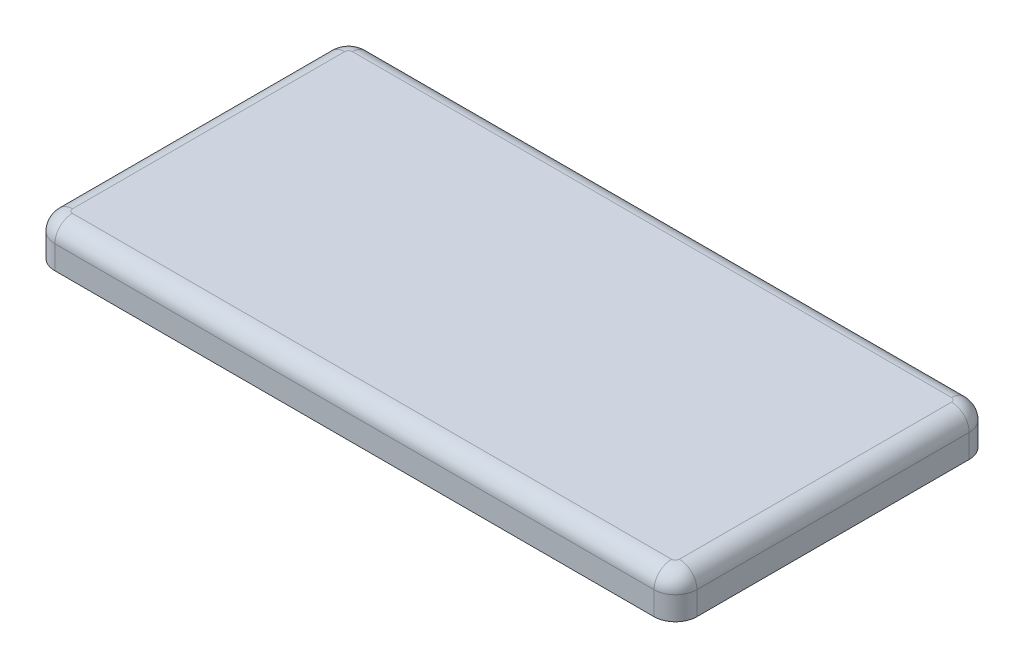
ISO-10303-21;
HEADER;
FILE_DESCRIPTION(('STEP AP214'),'2;1');
FILE_NAME('part.step','',(''),(''),'','','');
FILE_SCHEMA(('AUTOMOTIVE_DESIGN { 1 0 10303 214 1 1 1 1 }'));
ENDSEC;
DATA;
#1=APPLICATION_CONTEXT('core data for automotive mechanical design processes');
#2=APPLICATION_PROTOCOL_DEFINITION('international standard','automotive_design',2000,#1);
#3=PRODUCT_CONTEXT('',#1,'mechanical');
#4=PRODUCT('Part','Part','',(#3));
#5=PRODUCT_RELATED_PRODUCT_CATEGORY('part','',(#4));
#6=PRODUCT_DEFINITION_FORMATION('','',#4);
#7=PRODUCT_DEFINITION_CONTEXT('part definition',#1,'design');
#8=PRODUCT_DEFINITION('design','',#6,#7);
#9=PRODUCT_DEFINITION_SHAPE('','',#8);
#10=(LENGTH_UNIT() NAMED_UNIT(*) SI_UNIT(.MILLI.,.METRE.));
#11=(NAMED_UNIT(*) PLANE_ANGLE_UNIT() SI_UNIT($,.RADIAN.));
#12=(NAMED_UNIT(*) SI_UNIT($,.STERADIAN.) SOLID_ANGLE_UNIT());
#13=UNCERTAINTY_MEASURE_WITH_UNIT(LENGTH_MEASURE(1.E-05),#10,'distance_accuracy_value','');
#14=(GEOMETRIC_REPRESENTATION_CONTEXT(3) GLOBAL_UNCERTAINTY_ASSIGNED_CONTEXT((#13)) GLOBAL_UNIT_ASSIGNED_CONTEXT((#10,
#11,#12)) REPRESENTATION_CONTEXT('',''));
#15=CARTESIAN_POINT('',(0.,0.,0.));
#16=DIRECTION('',(0.,0.,1.));
#17=DIRECTION('',(1.,0.,0.));
#18=AXIS2_PLACEMENT_3D('',#15,#16,#17);
#19=CARTESIAN_POINT('',(-30.7,4.2,13.95));
#20=DIRECTION('',(0.,-1.,0.));
#21=DIRECTION('',(0.,0.,-1.));
#22=AXIS2_PLACEMENT_3D('',#19,#20,#21);
#23=CYLINDRICAL_SURFACE('',#22,2.2);
#24=DIRECTION('',(0.,-1.,0.));
#25=VECTOR('',#24,1.);
#26=CARTESIAN_POINT('',(-30.7,4.2,16.15));
#27=LINE('',#26,#25);
#28=CARTESIAN_POINT('',(-30.7,2.4,16.15));
#29=VERTEX_POINT('',#28);
#30=CARTESIAN_POINT('',(-30.7,0.,16.15));
#31=VERTEX_POINT('',#30);
#32=EDGE_CURVE('E309',#29,#31,#27,.T.);
#33=ORIENTED_EDGE('',*,*,#32,.F.);
#34=CARTESIAN_POINT('',(-30.7,2.4,13.95));
#35=DIRECTION('',(0.,1.,0.));
#36=DIRECTION('',(0.,0.,1.));
#37=AXIS2_PLACEMENT_3D('',#34,#35,#36);
#38=CIRCLE('',#37,2.2);
#39=CARTESIAN_POINT('',(-32.9,2.4,13.95));
#40=VERTEX_POINT('',#39);
#41=EDGE_CURVE('E44',#29,#40,#38,.F.);
#42=ORIENTED_EDGE('',*,*,#41,.T.);
#43=DIRECTION('',(0.,-1.,0.));
#44=VECTOR('',#43,1.);
#45=CARTESIAN_POINT('',(-32.9,4.2,13.95));
#46=LINE('',#45,#44);
#47=CARTESIAN_POINT('',(-32.9,0.,13.95));
#48=VERTEX_POINT('',#47);
#49=EDGE_CURVE('E295',#40,#48,#46,.T.);
#50=ORIENTED_EDGE('',*,*,#49,.T.);
#51=CARTESIAN_POINT('',(-30.7,0.,13.95));
#52=DIRECTION('',(0.,1.,0.));
#53=DIRECTION('',(0.,0.,1.));
#54=AXIS2_PLACEMENT_3D('',#51,#52,#53);
#55=CIRCLE('',#54,2.2);
#56=EDGE_CURVE('E271',#48,#31,#55,.T.);
#57=ORIENTED_EDGE('',*,*,#56,.T.);
#58=EDGE_LOOP('',(#33,#42,#50,#57));
#59=FACE_BOUND('',#58,.T.);
#60=ADVANCED_FACE('F35',(#59),#23,.T.);
#61=CARTESIAN_POINT('',(-30.7,4.2,16.15));
#62=DIRECTION('',(0.,0.,-1.));
#63=DIRECTION('',(-1.,0.,0.));
#64=AXIS2_PLACEMENT_3D('',#61,#62,#63);
#65=PLANE('',#64);
#66=DIRECTION('',(0.,-1.,0.));
#67=VECTOR('',#66,1.);
#68=CARTESIAN_POINT('',(30.7,4.2,16.15));
#69=LINE('',#68,#67);
#70=CARTESIAN_POINT('',(30.7,2.4,16.15));
#71=VERTEX_POINT('',#70);
#72=CARTESIAN_POINT('',(30.7,0.,16.15));
#73=VERTEX_POINT('',#72);
#74=EDGE_CURVE('E307',#71,#73,#69,.T.);
#75=ORIENTED_EDGE('',*,*,#74,.F.);
#76=DIRECTION('',(1.,0.,0.));
#77=VECTOR('',#76,1.);
#78=CARTESIAN_POINT('',(-30.7,2.4,16.15));
#79=LINE('',#78,#77);
#80=EDGE_CURVE('E11',#71,#29,#79,.F.);
#81=ORIENTED_EDGE('',*,*,#80,.T.);
#82=ORIENTED_EDGE('',*,*,#32,.T.);
#83=DIRECTION('',(1.,0.,0.));
#84=VECTOR('',#83,1.);
#85=CARTESIAN_POINT('',(-30.7,0.,16.15));
#86=LINE('',#85,#84);
#87=EDGE_CURVE('E274',#31,#73,#86,.T.);
#88=ORIENTED_EDGE('',*,*,#87,.T.);
#89=EDGE_LOOP('',(#75,#81,#82,#88));
#90=FACE_BOUND('',#89,.T.);
#91=ADVANCED_FACE('F423',(#90),#65,.F.);
#92=CARTESIAN_POINT('',(30.7,4.2,13.95));
#93=DIRECTION('',(0.,-1.,0.));
#94=DIRECTION('',(0.,0.,-1.));
#95=AXIS2_PLACEMENT_3D('',#92,#93,#94);
#96=CYLINDRICAL_SURFACE('',#95,2.2);
#97=DIRECTION('',(0.,-1.,0.));
#98=VECTOR('',#97,1.);
#99=CARTESIAN_POINT('',(32.9,4.2,13.95));
#100=LINE('',#99,#98);
#101=CARTESIAN_POINT('',(32.9,2.4,13.95));
#102=VERTEX_POINT('',#101);
#103=CARTESIAN_POINT('',(32.9,0.,13.95));
#104=VERTEX_POINT('',#103);
#105=EDGE_CURVE('E305',#102,#104,#100,.T.);
#106=ORIENTED_EDGE('',*,*,#105,.F.);
#107=CARTESIAN_POINT('',(30.7,2.4,13.95));
#108=DIRECTION('',(0.,1.,0.));
#109=DIRECTION('',(0.,0.,1.));
#110=AXIS2_PLACEMENT_3D('',#107,#108,#109);
#111=CIRCLE('',#110,2.2);
#112=EDGE_CURVE('E328',#102,#71,#111,.F.);
#113=ORIENTED_EDGE('',*,*,#112,.T.);
#114=ORIENTED_EDGE('',*,*,#74,.T.);
#115=CARTESIAN_POINT('',(30.7,0.,13.95));
#116=DIRECTION('',(0.,1.,0.));
#117=DIRECTION('',(0.,0.,1.));
#118=AXIS2_PLACEMENT_3D('',#115,#116,#117);
#119=CIRCLE('',#118,2.2);
#120=EDGE_CURVE('E277',#73,#104,#119,.T.);
#121=ORIENTED_EDGE('',*,*,#120,.T.);
#122=EDGE_LOOP('',(#106,#113,#114,#121));
#123=FACE_BOUND('',#122,.T.);
#124=ADVANCED_FACE('F421',(#123),#96,.T.);
#125=CARTESIAN_POINT('',(32.9,4.2,-13.95));
#126=DIRECTION('',(-1.,0.,0.));
#127=DIRECTION('',(0.,0.,1.));
#128=AXIS2_PLACEMENT_3D('',#125,#126,#127);
#129=PLANE('',#128);
#130=DIRECTION('',(0.,-1.,0.));
#131=VECTOR('',#130,1.);
#132=CARTESIAN_POINT('',(32.9,4.2,-13.95));
#133=LINE('',#132,#131);
#134=CARTESIAN_POINT('',(32.9,2.4,-13.95));
#135=VERTEX_POINT('',#134);
#136=CARTESIAN_POINT('',(32.9,0.,-13.95));
#137=VERTEX_POINT('',#136);
#138=EDGE_CURVE('E303',#135,#137,#133,.T.);
#139=ORIENTED_EDGE('',*,*,#138,.F.);
#140=DIRECTION('',(0.,0.,-1.));
#141=VECTOR('',#140,1.);
#142=CARTESIAN_POINT('',(32.9,2.4,13.95));
#143=LINE('',#142,#141);
#144=EDGE_CURVE('E331',#135,#102,#143,.F.);
#145=ORIENTED_EDGE('',*,*,#144,.T.);
#146=ORIENTED_EDGE('',*,*,#105,.T.);
#147=DIRECTION('',(0.,0.,-1.));
#148=VECTOR('',#147,1.);
#149=CARTESIAN_POINT('',(32.9,0.,-13.95));
#150=LINE('',#149,#148);
#151=EDGE_CURVE('E280',#104,#137,#150,.T.);
#152=ORIENTED_EDGE('',*,*,#151,.T.);
#153=EDGE_LOOP('',(#139,#145,#146,#152));
#154=FACE_BOUND('',#153,.T.);
#155=ADVANCED_FACE('F416',(#154),#129,.F.);
#156=CARTESIAN_POINT('',(30.7,4.2,-13.95));
#157=DIRECTION('',(0.,-1.,0.));
#158=DIRECTION('',(0.,0.,-1.));
#159=AXIS2_PLACEMENT_3D('',#156,#157,#158);
#160=CYLINDRICAL_SURFACE('',#159,2.2);
#161=DIRECTION('',(0.,-1.,0.));
#162=VECTOR('',#161,1.);
#163=CARTESIAN_POINT('',(30.7,4.2,-16.15));
#164=LINE('',#163,#162);
#165=CARTESIAN_POINT('',(30.7,2.4,-16.15));
#166=VERTEX_POINT('',#165);
#167=CARTESIAN_POINT('',(30.7,0.,-16.15));
#168=VERTEX_POINT('',#167);
#169=EDGE_CURVE('E301',#166,#168,#164,.T.);
#170=ORIENTED_EDGE('',*,*,#169,.F.);
#171=CARTESIAN_POINT('',(30.7,2.4,-13.95));
#172=DIRECTION('',(0.,1.,0.));
#173=DIRECTION('',(0.,0.,1.));
#174=AXIS2_PLACEMENT_3D('',#171,#172,#173);
#175=CIRCLE('',#174,2.2);
#176=EDGE_CURVE('E333',#166,#135,#175,.F.);
#177=ORIENTED_EDGE('',*,*,#176,.T.);
#178=ORIENTED_EDGE('',*,*,#138,.T.);
#179=CARTESIAN_POINT('',(30.7,0.,-13.95));
#180=DIRECTION('',(0.,1.,0.));
#181=DIRECTION('',(0.,0.,-1.));
#182=AXIS2_PLACEMENT_3D('',#179,#180,#181);
#183=CIRCLE('',#182,2.2);
#184=EDGE_CURVE('E283',#137,#168,#183,.T.);
#185=ORIENTED_EDGE('',*,*,#184,.T.);
#186=EDGE_LOOP('',(#170,#177,#178,#185));
#187=FACE_BOUND('',#186,.T.);
#188=ADVANCED_FACE('F414',(#187),#160,.T.);
#189=CARTESIAN_POINT('',(-30.7,4.2,-16.15));
#190=DIRECTION('',(0.,0.,1.));
#191=DIRECTION('',(1.,0.,0.));
#192=AXIS2_PLACEMENT_3D('',#189,#190,#191);
#193=PLANE('',#192);
#194=DIRECTION('',(0.,-1.,0.));
#195=VECTOR('',#194,1.);
#196=CARTESIAN_POINT('',(-30.7,4.2,-16.15));
#197=LINE('',#196,#195);
#198=CARTESIAN_POINT('',(-30.7,2.4,-16.15));
#199=VERTEX_POINT('',#198);
#200=CARTESIAN_POINT('',(-30.7,0.,-16.15));
#201=VERTEX_POINT('',#200);
#202=EDGE_CURVE('E299',#199,#201,#197,.T.);
#203=ORIENTED_EDGE('',*,*,#202,.F.);
#204=DIRECTION('',(-1.,0.,0.));
#205=VECTOR('',#204,1.);
#206=CARTESIAN_POINT('',(30.7,2.4,-16.15));
#207=LINE('',#206,#205);
#208=EDGE_CURVE('E335',#199,#166,#207,.F.);
#209=ORIENTED_EDGE('',*,*,#208,.T.);
#210=ORIENTED_EDGE('',*,*,#169,.T.);
#211=DIRECTION('',(-1.,0.,0.));
#212=VECTOR('',#211,1.);
#213=CARTESIAN_POINT('',(-30.7,0.,-16.15));
#214=LINE('',#213,#212);
#215=EDGE_CURVE('E286',#168,#201,#214,.T.);
#216=ORIENTED_EDGE('',*,*,#215,.T.);
#217=EDGE_LOOP('',(#203,#209,#210,#216));
#218=FACE_BOUND('',#217,.T.);
#219=ADVANCED_FACE('F378',(#218),#193,.F.);
#220=CARTESIAN_POINT('',(-30.7,4.2,-13.95));
#221=DIRECTION('',(0.,-1.,0.));
#222=DIRECTION('',(0.,0.,-1.));
#223=AXIS2_PLACEMENT_3D('',#220,#221,#222);
#224=CYLINDRICAL_SURFACE('',#223,2.2);
#225=DIRECTION('',(0.,-1.,0.));
#226=VECTOR('',#225,1.);
#227=CARTESIAN_POINT('',(-32.9,4.2,-13.95));
#228=LINE('',#227,#226);
#229=CARTESIAN_POINT('',(-32.9,2.4,-13.95));
#230=VERTEX_POINT('',#229);
#231=CARTESIAN_POINT('',(-32.9,0.,-13.95));
#232=VERTEX_POINT('',#231);
#233=EDGE_CURVE('E297',#230,#232,#228,.T.);
#234=ORIENTED_EDGE('',*,*,#233,.F.);
#235=CARTESIAN_POINT('',(-30.7,2.4,-13.95));
#236=DIRECTION('',(0.,1.,0.));
#237=DIRECTION('',(0.,0.,1.));
#238=AXIS2_PLACEMENT_3D('',#235,#236,#237);
#239=CIRCLE('',#238,2.2);
#240=EDGE_CURVE('E337',#230,#199,#239,.F.);
#241=ORIENTED_EDGE('',*,*,#240,.T.);
#242=ORIENTED_EDGE('',*,*,#202,.T.);
#243=CARTESIAN_POINT('',(-30.7,0.,-13.95));
#244=DIRECTION('',(0.,1.,0.));
#245=DIRECTION('',(0.,0.,1.));
#246=AXIS2_PLACEMENT_3D('',#243,#244,#245);
#247=CIRCLE('',#246,2.2);
#248=EDGE_CURVE('E289',#201,#232,#247,.T.);
#249=ORIENTED_EDGE('',*,*,#248,.T.);
#250=EDGE_LOOP('',(#234,#241,#242,#249));
#251=FACE_BOUND('',#250,.T.);
#252=ADVANCED_FACE('F376',(#251),#224,.T.);
#253=CARTESIAN_POINT('',(-32.9,4.2,-13.95));
#254=DIRECTION('',(1.,0.,0.));
#255=DIRECTION('',(0.,0.,-1.));
#256=AXIS2_PLACEMENT_3D('',#253,#254,#255);
#257=PLANE('',#256);
#258=ORIENTED_EDGE('',*,*,#49,.F.);
#259=DIRECTION('',(0.,0.,1.));
#260=VECTOR('',#259,1.);
#261=CARTESIAN_POINT('',(-32.9,2.4,-13.95));
#262=LINE('',#261,#260);
#263=EDGE_CURVE('E339',#40,#230,#262,.F.);
#264=ORIENTED_EDGE('',*,*,#263,.T.);
#265=ORIENTED_EDGE('',*,*,#233,.T.);
#266=DIRECTION('',(0.,0.,1.));
#267=VECTOR('',#266,1.);
#268=CARTESIAN_POINT('',(-32.9,0.,-13.95));
#269=LINE('',#268,#267);
#270=EDGE_CURVE('E292',#232,#48,#269,.T.);
#271=ORIENTED_EDGE('',*,*,#270,.T.);
#272=EDGE_LOOP('',(#258,#264,#265,#271));
#273=FACE_BOUND('',#272,.T.);
#274=ADVANCED_FACE('F390',(#273),#257,.F.);
#275=CARTESIAN_POINT('',(-30.7,4.2,13.95));
#276=DIRECTION('',(0.,1.,0.));
#277=DIRECTION('',(0.,0.,1.));
#278=AXIS2_PLACEMENT_3D('',#275,#276,#277);
#279=PLANE('',#278);
#280=DIRECTION('',(1.,0.,0.));
#281=VECTOR('',#280,1.);
#282=CARTESIAN_POINT('',(30.7,4.2,14.35));
#283=LINE('',#282,#281);
#284=CARTESIAN_POINT('',(-30.7,4.2,14.35));
#285=VERTEX_POINT('',#284);
#286=CARTESIAN_POINT('',(30.7,4.2,14.35));
#287=VERTEX_POINT('',#286);
#288=EDGE_CURVE('E311',#285,#287,#283,.T.);
#289=ORIENTED_EDGE('',*,*,#288,.T.);
#290=CARTESIAN_POINT('',(30.7,4.2,13.95));
#291=DIRECTION('',(0.,1.,0.));
#292=DIRECTION('',(0.,0.,1.));
#293=AXIS2_PLACEMENT_3D('',#290,#291,#292);
#294=CIRCLE('',#293,0.400000000000001);
#295=CARTESIAN_POINT('',(31.1,4.2,13.95));
#296=VERTEX_POINT('',#295);
#297=EDGE_CURVE('E325',#287,#296,#294,.T.);
#298=ORIENTED_EDGE('',*,*,#297,.T.);
#299=DIRECTION('',(0.,0.,-1.));
#300=VECTOR('',#299,1.);
#301=CARTESIAN_POINT('',(31.1,4.2,-13.95));
#302=LINE('',#301,#300);
#303=CARTESIAN_POINT('',(31.1,4.2,-13.95));
#304=VERTEX_POINT('',#303);
#305=EDGE_CURVE('E323',#296,#304,#302,.T.);
#306=ORIENTED_EDGE('',*,*,#305,.T.);
#307=CARTESIAN_POINT('',(30.7,4.2,-13.95));
#308=DIRECTION('',(0.,1.,0.));
#309=DIRECTION('',(0.,0.,1.));
#310=AXIS2_PLACEMENT_3D('',#307,#308,#309);
#311=CIRCLE('',#310,0.400000000000001);
#312=CARTESIAN_POINT('',(30.7,4.2,-14.35));
#313=VERTEX_POINT('',#312);
#314=EDGE_CURVE('E321',#304,#313,#311,.T.);
#315=ORIENTED_EDGE('',*,*,#314,.T.);
#316=DIRECTION('',(-1.,0.,0.));
#317=VECTOR('',#316,1.);
#318=CARTESIAN_POINT('',(-30.7,4.2,-14.35));
#319=LINE('',#318,#317);
#320=CARTESIAN_POINT('',(-30.7,4.2,-14.35));
#321=VERTEX_POINT('',#320);
#322=EDGE_CURVE('E319',#313,#321,#319,.T.);
#323=ORIENTED_EDGE('',*,*,#322,.T.);
#324=CARTESIAN_POINT('',(-30.7,4.2,-13.95));
#325=DIRECTION('',(0.,1.,0.));
#326=DIRECTION('',(0.,0.,1.));
#327=AXIS2_PLACEMENT_3D('',#324,#325,#326);
#328=CIRCLE('',#327,0.4);
#329=CARTESIAN_POINT('',(-31.1,4.2,-13.95));
#330=VERTEX_POINT('',#329);
#331=EDGE_CURVE('E317',#321,#330,#328,.T.);
#332=ORIENTED_EDGE('',*,*,#331,.T.);
#333=DIRECTION('',(0.,0.,1.));
#334=VECTOR('',#333,1.);
#335=CARTESIAN_POINT('',(-31.1,4.2,13.95));
#336=LINE('',#335,#334);
#337=CARTESIAN_POINT('',(-31.1,4.2,13.95));
#338=VERTEX_POINT('',#337);
#339=EDGE_CURVE('E315',#330,#338,#336,.T.);
#340=ORIENTED_EDGE('',*,*,#339,.T.);
#341=CARTESIAN_POINT('',(-30.7,4.2,13.95));
#342=DIRECTION('',(0.,1.,0.));
#343=DIRECTION('',(0.,0.,1.));
#344=AXIS2_PLACEMENT_3D('',#341,#342,#343);
#345=CIRCLE('',#344,0.400000000000001);
#346=EDGE_CURVE('E313',#338,#285,#345,.T.);
#347=ORIENTED_EDGE('',*,*,#346,.T.);
#348=EDGE_LOOP('',(#289,#298,#306,#315,#323,#332,#340,#347));
#349=FACE_BOUND('',#348,.T.);
#350=ADVANCED_FACE('F403',(#349),#279,.T.);
#351=CARTESIAN_POINT('',(-30.7,0.,13.95));
#352=DIRECTION('',(0.,1.,0.));
#353=DIRECTION('',(0.,0.,1.));
#354=AXIS2_PLACEMENT_3D('',#351,#352,#353);
#355=PLANE('',#354);
#356=DIRECTION('',(0.,0.,1.));
#357=VECTOR('',#356,1.);
#358=CARTESIAN_POINT('',(-31.9,0.,-13.95));
#359=LINE('',#358,#357);
#360=CARTESIAN_POINT('',(-31.9,0.,-13.95));
#361=VERTEX_POINT('',#360);
#362=CARTESIAN_POINT('',(-31.9,0.,13.95));
#363=VERTEX_POINT('',#362);
#364=EDGE_CURVE('E221',#361,#363,#359,.T.);
#365=ORIENTED_EDGE('',*,*,#364,.T.);
#366=CARTESIAN_POINT('',(-30.7,0.,13.95));
#367=DIRECTION('',(0.,1.,0.));
#368=DIRECTION('',(0.,0.,1.));
#369=AXIS2_PLACEMENT_3D('',#366,#367,#368);
#370=CIRCLE('',#369,1.2);
#371=CARTESIAN_POINT('',(-30.7,0.,15.15));
#372=VERTEX_POINT('',#371);
#373=EDGE_CURVE('E216',#363,#372,#370,.T.);
#374=ORIENTED_EDGE('',*,*,#373,.T.);
#375=DIRECTION('',(1.,0.,0.));
#376=VECTOR('',#375,1.);
#377=CARTESIAN_POINT('',(-30.7,0.,15.15));
#378=LINE('',#377,#376);
#379=CARTESIAN_POINT('',(30.7,0.,15.15));
#380=VERTEX_POINT('',#379);
#381=EDGE_CURVE('E254',#372,#380,#378,.T.);
#382=ORIENTED_EDGE('',*,*,#381,.T.);
#383=CARTESIAN_POINT('',(30.7,0.,13.95));
#384=DIRECTION('',(0.,1.,0.));
#385=DIRECTION('',(0.,0.,1.));
#386=AXIS2_PLACEMENT_3D('',#383,#384,#385);
#387=CIRCLE('',#386,1.2);
#388=CARTESIAN_POINT('',(31.9,0.,13.95));
#389=VERTEX_POINT('',#388);
#390=EDGE_CURVE('E52',#380,#389,#387,.T.);
#391=ORIENTED_EDGE('',*,*,#390,.T.);
#392=DIRECTION('',(0.,0.,-1.));
#393=VECTOR('',#392,1.);
#394=CARTESIAN_POINT('',(31.9,0.,-13.95));
#395=LINE('',#394,#393);
#396=CARTESIAN_POINT('',(31.9,0.,-13.95));
#397=VERTEX_POINT('',#396);
#398=EDGE_CURVE('E265',#389,#397,#395,.T.);
#399=ORIENTED_EDGE('',*,*,#398,.T.);
#400=CARTESIAN_POINT('',(30.7,0.,-13.95));
#401=DIRECTION('',(0.,1.,0.));
#402=DIRECTION('',(0.,0.,1.));
#403=AXIS2_PLACEMENT_3D('',#400,#401,#402);
#404=CIRCLE('',#403,1.2);
#405=CARTESIAN_POINT('',(30.7,0.,-15.15));
#406=VERTEX_POINT('',#405);
#407=EDGE_CURVE('E262',#397,#406,#404,.T.);
#408=ORIENTED_EDGE('',*,*,#407,.T.);
#409=DIRECTION('',(-1.,0.,0.));
#410=VECTOR('',#409,1.);
#411=CARTESIAN_POINT('',(-30.7,0.,-15.15));
#412=LINE('',#411,#410);
#413=CARTESIAN_POINT('',(-30.7,0.,-15.15));
#414=VERTEX_POINT('',#413);
#415=EDGE_CURVE('E259',#406,#414,#412,.T.);
#416=ORIENTED_EDGE('',*,*,#415,.T.);
#417=CARTESIAN_POINT('',(-30.7,0.,-13.95));
#418=DIRECTION('',(0.,1.,0.));
#419=DIRECTION('',(0.,0.,1.));
#420=AXIS2_PLACEMENT_3D('',#417,#418,#419);
#421=CIRCLE('',#420,1.2);
#422=EDGE_CURVE('E256',#414,#361,#421,.T.);
#423=ORIENTED_EDGE('',*,*,#422,.T.);
#424=EDGE_LOOP('',(#365,#374,#382,#391,#399,#408,#416,#423));
#425=FACE_BOUND('',#424,.T.);
#426=ORIENTED_EDGE('',*,*,#56,.F.);
#427=ORIENTED_EDGE('',*,*,#270,.F.);
#428=ORIENTED_EDGE('',*,*,#248,.F.);
#429=ORIENTED_EDGE('',*,*,#215,.F.);
#430=ORIENTED_EDGE('',*,*,#184,.F.);
#431=ORIENTED_EDGE('',*,*,#151,.F.);
#432=ORIENTED_EDGE('',*,*,#120,.F.);
#433=ORIENTED_EDGE('',*,*,#87,.F.);
#434=EDGE_LOOP('',(#426,#427,#428,#429,#430,#431,#432,#433));
#435=FACE_BOUND('',#434,.T.);
#436=ADVANCED_FACE('F386',(#425,#435),#355,.F.);
#437=CARTESIAN_POINT('',(-30.7,2.4,-13.95));
#438=DIRECTION('',(0.,1.,0.));
#439=DIRECTION('',(0.,0.,1.));
#440=AXIS2_PLACEMENT_3D('',#437,#438,#439);
#441=DEGENERATE_TOROIDAL_SURFACE('',#440,0.4,1.8,.T.);
#442=CARTESIAN_POINT('',(-30.7,2.4,-14.35));
#443=DIRECTION('',(1.,0.,0.));
#444=DIRECTION('',(0.,0.,-1.));
#445=AXIS2_PLACEMENT_3D('',#442,#443,#444);
#446=CIRCLE('',#445,1.8);
#447=EDGE_CURVE('E357',#199,#321,#446,.T.);
#448=ORIENTED_EDGE('',*,*,#447,.F.);
#449=ORIENTED_EDGE('',*,*,#240,.F.);
#450=CARTESIAN_POINT('',(-31.1,2.4,-13.95));
#451=DIRECTION('',(0.,0.,1.));
#452=DIRECTION('',(1.,0.,0.));
#453=AXIS2_PLACEMENT_3D('',#450,#451,#452);
#454=CIRCLE('',#453,1.8);
#455=EDGE_CURVE('E39',#330,#230,#454,.T.);
#456=ORIENTED_EDGE('',*,*,#455,.F.);
#457=ORIENTED_EDGE('',*,*,#331,.F.);
#458=EDGE_LOOP('',(#448,#449,#456,#457));
#459=FACE_BOUND('',#458,.T.);
#460=ADVANCED_FACE('F37',(#459),#441,.T.);
#461=CARTESIAN_POINT('',(-31.1,2.4,13.95));
#462=DIRECTION('',(0.,0.,-1.));
#463=DIRECTION('',(-1.,0.,0.));
#464=AXIS2_PLACEMENT_3D('',#461,#462,#463);
#465=CYLINDRICAL_SURFACE('',#464,1.8);
#466=ORIENTED_EDGE('',*,*,#455,.T.);
#467=ORIENTED_EDGE('',*,*,#263,.F.);
#468=CARTESIAN_POINT('',(-31.1,2.4,13.95));
#469=DIRECTION('',(0.,0.,1.));
#470=DIRECTION('',(1.,0.,0.));
#471=AXIS2_PLACEMENT_3D('',#468,#469,#470);
#472=CIRCLE('',#471,1.8);
#473=EDGE_CURVE('E355',#338,#40,#472,.T.);
#474=ORIENTED_EDGE('',*,*,#473,.F.);
#475=ORIENTED_EDGE('',*,*,#339,.F.);
#476=EDGE_LOOP('',(#466,#467,#474,#475));
#477=FACE_BOUND('',#476,.T.);
#478=ADVANCED_FACE('F368',(#477),#465,.T.);
#479=CARTESIAN_POINT('',(-30.7,2.4,-14.35));
#480=DIRECTION('',(1.,0.,0.));
#481=DIRECTION('',(0.,0.,-1.));
#482=AXIS2_PLACEMENT_3D('',#479,#480,#481);
#483=CYLINDRICAL_SURFACE('',#482,1.8);
#484=ORIENTED_EDGE('',*,*,#447,.T.);
#485=ORIENTED_EDGE('',*,*,#322,.F.);
#486=CARTESIAN_POINT('',(30.7,2.4,-14.35));
#487=DIRECTION('',(1.,0.,0.));
#488=DIRECTION('',(0.,1.,0.));
#489=AXIS2_PLACEMENT_3D('',#486,#487,#488);
#490=CIRCLE('',#489,1.8);
#491=EDGE_CURVE('E352',#166,#313,#490,.T.);
#492=ORIENTED_EDGE('',*,*,#491,.F.);
#493=ORIENTED_EDGE('',*,*,#208,.F.);
#494=EDGE_LOOP('',(#484,#485,#492,#493));
#495=FACE_BOUND('',#494,.T.);
#496=ADVANCED_FACE('F406',(#495),#483,.T.);
#497=CARTESIAN_POINT('',(-30.7,2.4,13.95));
#498=DIRECTION('',(0.,1.,0.));
#499=DIRECTION('',(0.,0.,1.));
#500=AXIS2_PLACEMENT_3D('',#497,#498,#499);
#501=DEGENERATE_TOROIDAL_SURFACE('',#500,0.400000000000001,1.8,.T.);
#502=ORIENTED_EDGE('',*,*,#473,.T.);
#503=ORIENTED_EDGE('',*,*,#41,.F.);
#504=CARTESIAN_POINT('',(-30.7,2.4,14.35));
#505=DIRECTION('',(1.,0.,0.));
#506=DIRECTION('',(0.,0.,-1.));
#507=AXIS2_PLACEMENT_3D('',#504,#505,#506);
#508=CIRCLE('',#507,1.8);
#509=EDGE_CURVE('E349',#285,#29,#508,.T.);
#510=ORIENTED_EDGE('',*,*,#509,.F.);
#511=ORIENTED_EDGE('',*,*,#346,.F.);
#512=EDGE_LOOP('',(#502,#503,#510,#511));
#513=FACE_BOUND('',#512,.T.);
#514=ADVANCED_FACE('F395',(#513),#501,.T.);
#515=CARTESIAN_POINT('',(30.7,2.4,-13.95));
#516=DIRECTION('',(0.,1.,0.));
#517=DIRECTION('',(0.,0.,1.));
#518=AXIS2_PLACEMENT_3D('',#515,#516,#517);
#519=DEGENERATE_TOROIDAL_SURFACE('',#518,0.400000000000001,1.8,.T.);
#520=ORIENTED_EDGE('',*,*,#491,.T.);
#521=ORIENTED_EDGE('',*,*,#314,.F.);
#522=CARTESIAN_POINT('',(31.1,2.4,-13.95));
#523=DIRECTION('',(0.,0.,1.));
#524=DIRECTION('',(1.,0.,0.));
#525=AXIS2_PLACEMENT_3D('',#522,#523,#524);
#526=CIRCLE('',#525,1.8);
#527=EDGE_CURVE('E346',#135,#304,#526,.T.);
#528=ORIENTED_EDGE('',*,*,#527,.F.);
#529=ORIENTED_EDGE('',*,*,#176,.F.);
#530=EDGE_LOOP('',(#520,#521,#528,#529));
#531=FACE_BOUND('',#530,.T.);
#532=ADVANCED_FACE('F409',(#531),#519,.T.);
#533=CARTESIAN_POINT('',(-30.7,2.4,14.35));
#534=DIRECTION('',(-1.,0.,0.));
#535=DIRECTION('',(0.,0.,1.));
#536=AXIS2_PLACEMENT_3D('',#533,#534,#535);
#537=CYLINDRICAL_SURFACE('',#536,1.8);
#538=ORIENTED_EDGE('',*,*,#509,.T.);
#539=ORIENTED_EDGE('',*,*,#80,.F.);
#540=CARTESIAN_POINT('',(30.7,2.4,14.35));
#541=DIRECTION('',(1.,0.,0.));
#542=DIRECTION('',(0.,0.,-1.));
#543=AXIS2_PLACEMENT_3D('',#540,#541,#542);
#544=CIRCLE('',#543,1.8);
#545=EDGE_CURVE('E344',#287,#71,#544,.T.);
#546=ORIENTED_EDGE('',*,*,#545,.F.);
#547=ORIENTED_EDGE('',*,*,#288,.F.);
#548=EDGE_LOOP('',(#538,#539,#546,#547));
#549=FACE_BOUND('',#548,.T.);
#550=ADVANCED_FACE('F399',(#549),#537,.T.);
#551=CARTESIAN_POINT('',(31.1,2.4,13.95));
#552=DIRECTION('',(0.,0.,1.));
#553=DIRECTION('',(1.,0.,0.));
#554=AXIS2_PLACEMENT_3D('',#551,#552,#553);
#555=CYLINDRICAL_SURFACE('',#554,1.8);
#556=ORIENTED_EDGE('',*,*,#527,.T.);
#557=ORIENTED_EDGE('',*,*,#305,.F.);
#558=CARTESIAN_POINT('',(31.1,2.4,13.95));
#559=DIRECTION('',(0.,0.,1.));
#560=DIRECTION('',(0.,-1.,0.));
#561=AXIS2_PLACEMENT_3D('',#558,#559,#560);
#562=CIRCLE('',#561,1.8);
#563=EDGE_CURVE('E342',#102,#296,#562,.T.);
#564=ORIENTED_EDGE('',*,*,#563,.F.);
#565=ORIENTED_EDGE('',*,*,#144,.F.);
#566=EDGE_LOOP('',(#556,#557,#564,#565));
#567=FACE_BOUND('',#566,.T.);
#568=ADVANCED_FACE('F437',(#567),#555,.T.);
#569=CARTESIAN_POINT('',(30.7,2.4,13.95));
#570=DIRECTION('',(0.,1.,0.));
#571=DIRECTION('',(0.,0.,1.));
#572=AXIS2_PLACEMENT_3D('',#569,#570,#571);
#573=DEGENERATE_TOROIDAL_SURFACE('',#572,0.400000000000001,1.8,.T.);
#574=ORIENTED_EDGE('',*,*,#545,.T.);
#575=ORIENTED_EDGE('',*,*,#112,.F.);
#576=ORIENTED_EDGE('',*,*,#563,.T.);
#577=ORIENTED_EDGE('',*,*,#297,.F.);
#578=EDGE_LOOP('',(#574,#575,#576,#577));
#579=FACE_BOUND('',#578,.T.);
#580=ADVANCED_FACE('F434',(#579),#573,.T.);
#581=CARTESIAN_POINT('',(-30.7,4.2,13.95));
#582=DIRECTION('',(0.,-1.,0.));
#583=DIRECTION('',(0.,0.,-1.));
#584=AXIS2_PLACEMENT_3D('',#581,#582,#583);
#585=CYLINDRICAL_SURFACE('',#584,1.2);
#586=DIRECTION('',(0.,1.,0.));
#587=VECTOR('',#586,1.);
#588=CARTESIAN_POINT('',(-30.7,4.2,15.15));
#589=LINE('',#588,#587);
#590=CARTESIAN_POINT('',(-30.7,2.4,15.15));
#591=VERTEX_POINT('',#590);
#592=EDGE_CURVE('E733',#591,#372,#589,.F.);
#593=ORIENTED_EDGE('',*,*,#592,.T.);
#594=ORIENTED_EDGE('',*,*,#373,.F.);
#595=DIRECTION('',(0.,-1.,0.));
#596=VECTOR('',#595,1.);
#597=CARTESIAN_POINT('',(-31.9,4.2,13.95));
#598=LINE('',#597,#596);
#599=CARTESIAN_POINT('',(-31.9,2.4,13.95));
#600=VERTEX_POINT('',#599);
#601=EDGE_CURVE('E212',#600,#363,#598,.T.);
#602=ORIENTED_EDGE('',*,*,#601,.F.);
#603=CARTESIAN_POINT('',(-30.7,2.4,13.95));
#604=DIRECTION('',(0.,-1.,0.));
#605=DIRECTION('',(0.,0.,-1.));
#606=AXIS2_PLACEMENT_3D('',#603,#604,#605);
#607=CIRCLE('',#606,1.2);
#608=EDGE_CURVE('E199',#591,#600,#607,.T.);
#609=ORIENTED_EDGE('',*,*,#608,.F.);
#610=EDGE_LOOP('',(#593,#594,#602,#609));
#611=FACE_BOUND('',#610,.T.);
#612=ADVANCED_FACE('F214',(#611),#585,.F.);
#613=CARTESIAN_POINT('',(-30.7,4.2,15.15));
#614=DIRECTION('',(0.,0.,-1.));
#615=DIRECTION('',(-1.,0.,0.));
#616=AXIS2_PLACEMENT_3D('',#613,#614,#615);
#617=PLANE('',#616);
#618=DIRECTION('',(0.,-1.,0.));
#619=VECTOR('',#618,1.);
#620=CARTESIAN_POINT('',(30.7,4.2,15.15));
#621=LINE('',#620,#619);
#622=CARTESIAN_POINT('',(30.7,2.4,15.15));
#623=VERTEX_POINT('',#622);
#624=EDGE_CURVE('E734',#623,#380,#621,.T.);
#625=ORIENTED_EDGE('',*,*,#624,.T.);
#626=ORIENTED_EDGE('',*,*,#381,.F.);
#627=ORIENTED_EDGE('',*,*,#592,.F.);
#628=DIRECTION('',(-1.,0.,0.));
#629=VECTOR('',#628,1.);
#630=CARTESIAN_POINT('',(-30.7,2.4,15.15));
#631=LINE('',#630,#629);
#632=EDGE_CURVE('E208',#623,#591,#631,.T.);
#633=ORIENTED_EDGE('',*,*,#632,.F.);
#634=EDGE_LOOP('',(#625,#626,#627,#633));
#635=FACE_BOUND('',#634,.T.);
#636=ADVANCED_FACE('F553',(#635),#617,.T.);
#637=CARTESIAN_POINT('',(30.7,4.2,13.95));
#638=DIRECTION('',(0.,-1.,0.));
#639=DIRECTION('',(0.,0.,-1.));
#640=AXIS2_PLACEMENT_3D('',#637,#638,#639);
#641=CYLINDRICAL_SURFACE('',#640,1.2);
#642=DIRECTION('',(0.,1.,0.));
#643=VECTOR('',#642,1.);
#644=CARTESIAN_POINT('',(31.9,4.2,13.95));
#645=LINE('',#644,#643);
#646=CARTESIAN_POINT('',(31.9,2.4,13.95));
#647=VERTEX_POINT('',#646);
#648=EDGE_CURVE('E738',#647,#389,#645,.F.);
#649=ORIENTED_EDGE('',*,*,#648,.T.);
#650=ORIENTED_EDGE('',*,*,#390,.F.);
#651=ORIENTED_EDGE('',*,*,#624,.F.);
#652=CARTESIAN_POINT('',(30.7,2.4,13.95));
#653=DIRECTION('',(0.,-1.,0.));
#654=DIRECTION('',(0.,0.,-1.));
#655=AXIS2_PLACEMENT_3D('',#652,#653,#654);
#656=CIRCLE('',#655,1.2);
#657=EDGE_CURVE('E715',#647,#623,#656,.T.);
#658=ORIENTED_EDGE('',*,*,#657,.F.);
#659=EDGE_LOOP('',(#649,#650,#651,#658));
#660=FACE_BOUND('',#659,.T.);
#661=ADVANCED_FACE('F562',(#660),#641,.F.);
#662=CARTESIAN_POINT('',(31.9,4.2,-13.95));
#663=DIRECTION('',(-1.,0.,0.));
#664=DIRECTION('',(0.,0.,1.));
#665=AXIS2_PLACEMENT_3D('',#662,#663,#664);
#666=PLANE('',#665);
#667=DIRECTION('',(0.,-1.,0.));
#668=VECTOR('',#667,1.);
#669=CARTESIAN_POINT('',(31.9,4.2,-13.95));
#670=LINE('',#669,#668);
#671=CARTESIAN_POINT('',(31.9,2.4,-13.95));
#672=VERTEX_POINT('',#671);
#673=EDGE_CURVE('E742',#672,#397,#670,.T.);
#674=ORIENTED_EDGE('',*,*,#673,.T.);
#675=ORIENTED_EDGE('',*,*,#398,.F.);
#676=ORIENTED_EDGE('',*,*,#648,.F.);
#677=DIRECTION('',(0.,0.,1.));
#678=VECTOR('',#677,1.);
#679=CARTESIAN_POINT('',(31.9,2.4,-13.95));
#680=LINE('',#679,#678);
#681=EDGE_CURVE('E723',#672,#647,#680,.T.);
#682=ORIENTED_EDGE('',*,*,#681,.F.);
#683=EDGE_LOOP('',(#674,#675,#676,#682));
#684=FACE_BOUND('',#683,.T.);
#685=ADVANCED_FACE('F572',(#684),#666,.T.);
#686=CARTESIAN_POINT('',(30.7,4.2,-13.95));
#687=DIRECTION('',(0.,-1.,0.));
#688=DIRECTION('',(0.,0.,-1.));
#689=AXIS2_PLACEMENT_3D('',#686,#687,#688);
#690=CYLINDRICAL_SURFACE('',#689,1.2);
#691=DIRECTION('',(0.,1.,0.));
#692=VECTOR('',#691,1.);
#693=CARTESIAN_POINT('',(30.7,4.2,-15.15));
#694=LINE('',#693,#692);
#695=CARTESIAN_POINT('',(30.7,2.4,-15.15));
#696=VERTEX_POINT('',#695);
#697=EDGE_CURVE('E745',#696,#406,#694,.F.);
#698=ORIENTED_EDGE('',*,*,#697,.T.);
#699=ORIENTED_EDGE('',*,*,#407,.F.);
#700=ORIENTED_EDGE('',*,*,#673,.F.);
#701=CARTESIAN_POINT('',(30.7,2.4,-13.95));
#702=DIRECTION('',(0.,-1.,0.));
#703=DIRECTION('',(0.,0.,-1.));
#704=AXIS2_PLACEMENT_3D('',#701,#702,#703);
#705=CIRCLE('',#704,1.2);
#706=EDGE_CURVE('E747',#696,#672,#705,.T.);
#707=ORIENTED_EDGE('',*,*,#706,.F.);
#708=EDGE_LOOP('',(#698,#699,#700,#707));
#709=FACE_BOUND('',#708,.T.);
#710=ADVANCED_FACE('F581',(#709),#690,.F.);
#711=CARTESIAN_POINT('',(-30.7,4.2,-15.15));
#712=DIRECTION('',(0.,0.,1.));
#713=DIRECTION('',(1.,0.,0.));
#714=AXIS2_PLACEMENT_3D('',#711,#712,#713);
#715=PLANE('',#714);
#716=DIRECTION('',(0.,-1.,0.));
#717=VECTOR('',#716,1.);
#718=CARTESIAN_POINT('',(-30.7,4.2,-15.15));
#719=LINE('',#718,#717);
#720=CARTESIAN_POINT('',(-30.7,2.4,-15.15));
#721=VERTEX_POINT('',#720);
#722=EDGE_CURVE('E749',#721,#414,#719,.T.);
#723=ORIENTED_EDGE('',*,*,#722,.T.);
#724=ORIENTED_EDGE('',*,*,#415,.F.);
#725=ORIENTED_EDGE('',*,*,#697,.F.);
#726=DIRECTION('',(1.,0.,0.));
#727=VECTOR('',#726,1.);
#728=CARTESIAN_POINT('',(-30.7,2.4,-15.15));
#729=LINE('',#728,#727);
#730=EDGE_CURVE('E751',#721,#696,#729,.T.);
#731=ORIENTED_EDGE('',*,*,#730,.F.);
#732=EDGE_LOOP('',(#723,#724,#725,#731));
#733=FACE_BOUND('',#732,.T.);
#734=ADVANCED_FACE('F591',(#733),#715,.T.);
#735=CARTESIAN_POINT('',(-30.7,4.2,-13.95));
#736=DIRECTION('',(0.,-1.,0.));
#737=DIRECTION('',(0.,0.,-1.));
#738=AXIS2_PLACEMENT_3D('',#735,#736,#737);
#739=CYLINDRICAL_SURFACE('',#738,1.2);
#740=DIRECTION('',(0.,1.,0.));
#741=VECTOR('',#740,1.);
#742=CARTESIAN_POINT('',(-31.9,4.2,-13.95));
#743=LINE('',#742,#741);
#744=CARTESIAN_POINT('',(-31.9,2.4,-13.95));
#745=VERTEX_POINT('',#744);
#746=EDGE_CURVE('E220',#745,#361,#743,.F.);
#747=ORIENTED_EDGE('',*,*,#746,.T.);
#748=ORIENTED_EDGE('',*,*,#422,.F.);
#749=ORIENTED_EDGE('',*,*,#722,.F.);
#750=CARTESIAN_POINT('',(-30.7,2.4,-13.95));
#751=DIRECTION('',(0.,-1.,0.));
#752=DIRECTION('',(0.,0.,-1.));
#753=AXIS2_PLACEMENT_3D('',#750,#751,#752);
#754=CIRCLE('',#753,1.2);
#755=EDGE_CURVE('E228',#745,#721,#754,.T.);
#756=ORIENTED_EDGE('',*,*,#755,.F.);
#757=EDGE_LOOP('',(#747,#748,#749,#756));
#758=FACE_BOUND('',#757,.T.);
#759=ADVANCED_FACE('F601',(#758),#739,.F.);
#760=CARTESIAN_POINT('',(-31.9,4.2,-13.95));
#761=DIRECTION('',(1.,0.,0.));
#762=DIRECTION('',(0.,0.,-1.));
#763=AXIS2_PLACEMENT_3D('',#760,#761,#762);
#764=PLANE('',#763);
#765=ORIENTED_EDGE('',*,*,#601,.T.);
#766=ORIENTED_EDGE('',*,*,#364,.F.);
#767=ORIENTED_EDGE('',*,*,#746,.F.);
#768=DIRECTION('',(0.,0.,-1.));
#769=VECTOR('',#768,1.);
#770=CARTESIAN_POINT('',(-31.9,2.4,-13.95));
#771=LINE('',#770,#769);
#772=EDGE_CURVE('E209',#600,#745,#771,.T.);
#773=ORIENTED_EDGE('',*,*,#772,.F.);
#774=EDGE_LOOP('',(#765,#766,#767,#773));
#775=FACE_BOUND('',#774,.T.);
#776=ADVANCED_FACE('F224',(#775),#764,.T.);
#777=CARTESIAN_POINT('',(-30.7,3.2,13.95));
#778=DIRECTION('',(0.,1.,0.));
#779=DIRECTION('',(0.,0.,1.));
#780=AXIS2_PLACEMENT_3D('',#777,#778,#779);
#781=PLANE('',#780);
#782=DIRECTION('',(1.,0.,0.));
#783=VECTOR('',#782,1.);
#784=CARTESIAN_POINT('',(-30.7,3.2,14.35));
#785=LINE('',#784,#783);
#786=CARTESIAN_POINT('',(-30.7,3.2,14.35));
#787=VERTEX_POINT('',#786);
#788=CARTESIAN_POINT('',(30.7,3.2,14.35));
#789=VERTEX_POINT('',#788);
#790=EDGE_CURVE('E719',#787,#789,#785,.T.);
#791=ORIENTED_EDGE('',*,*,#790,.F.);
#792=CARTESIAN_POINT('',(-30.7,3.2,13.95));
#793=DIRECTION('',(0.,1.,0.));
#794=DIRECTION('',(0.,0.,1.));
#795=AXIS2_PLACEMENT_3D('',#792,#793,#794);
#796=CIRCLE('',#795,0.400000000000001);
#797=CARTESIAN_POINT('',(-31.1,3.2,13.95));
#798=VERTEX_POINT('',#797);
#799=EDGE_CURVE('E243',#798,#787,#796,.T.);
#800=ORIENTED_EDGE('',*,*,#799,.F.);
#801=DIRECTION('',(0.,0.,1.));
#802=VECTOR('',#801,1.);
#803=CARTESIAN_POINT('',(-31.1,3.2,13.95));
#804=LINE('',#803,#802);
#805=CARTESIAN_POINT('',(-31.1,3.2,-13.95));
#806=VERTEX_POINT('',#805);
#807=EDGE_CURVE('E232',#806,#798,#804,.T.);
#808=ORIENTED_EDGE('',*,*,#807,.F.);
#809=CARTESIAN_POINT('',(-30.7,3.2,-13.95));
#810=DIRECTION('',(0.,1.,0.));
#811=DIRECTION('',(0.,0.,1.));
#812=AXIS2_PLACEMENT_3D('',#809,#810,#811);
#813=CIRCLE('',#812,0.4);
#814=CARTESIAN_POINT('',(-30.7,3.2,-14.35));
#815=VERTEX_POINT('',#814);
#816=EDGE_CURVE('E732',#815,#806,#813,.T.);
#817=ORIENTED_EDGE('',*,*,#816,.F.);
#818=DIRECTION('',(1.,0.,0.));
#819=VECTOR('',#818,1.);
#820=CARTESIAN_POINT('',(-30.7,3.2,-14.35));
#821=LINE('',#820,#819);
#822=CARTESIAN_POINT('',(30.7,3.2,-14.35));
#823=VERTEX_POINT('',#822);
#824=EDGE_CURVE('E731',#823,#815,#821,.F.);
#825=ORIENTED_EDGE('',*,*,#824,.F.);
#826=CARTESIAN_POINT('',(30.7,3.2,-13.95));
#827=DIRECTION('',(0.,1.,0.));
#828=DIRECTION('',(0.,0.,1.));
#829=AXIS2_PLACEMENT_3D('',#826,#827,#828);
#830=CIRCLE('',#829,0.400000000000001);
#831=CARTESIAN_POINT('',(31.1,3.2,-13.95));
#832=VERTEX_POINT('',#831);
#833=EDGE_CURVE('E725',#832,#823,#830,.T.);
#834=ORIENTED_EDGE('',*,*,#833,.F.);
#835=DIRECTION('',(0.,0.,1.));
#836=VECTOR('',#835,1.);
#837=CARTESIAN_POINT('',(31.1,3.2,13.95));
#838=LINE('',#837,#836);
#839=CARTESIAN_POINT('',(31.1,3.2,13.95));
#840=VERTEX_POINT('',#839);
#841=EDGE_CURVE('E721',#840,#832,#838,.F.);
#842=ORIENTED_EDGE('',*,*,#841,.F.);
#843=CARTESIAN_POINT('',(30.7,3.2,13.95));
#844=DIRECTION('',(0.,1.,0.));
#845=DIRECTION('',(0.,0.,1.));
#846=AXIS2_PLACEMENT_3D('',#843,#844,#845);
#847=CIRCLE('',#846,0.400000000000001);
#848=EDGE_CURVE('E713',#789,#840,#847,.T.);
#849=ORIENTED_EDGE('',*,*,#848,.F.);
#850=EDGE_LOOP('',(#791,#800,#808,#817,#825,#834,#842,#849));
#851=FACE_BOUND('',#850,.T.);
#852=ADVANCED_FACE('F620',(#851),#781,.F.);
#853=CARTESIAN_POINT('',(-30.7,2.4,-13.95));
#854=DIRECTION('',(0.,1.,0.));
#855=DIRECTION('',(0.,0.,1.));
#856=AXIS2_PLACEMENT_3D('',#853,#854,#855);
#857=DEGENERATE_TOROIDAL_SURFACE('',#856,0.4,0.8,.T.);
#858=CARTESIAN_POINT('',(-30.7,2.4,-14.35));
#859=DIRECTION('',(1.,0.,0.));
#860=DIRECTION('',(0.,0.,-1.));
#861=AXIS2_PLACEMENT_3D('',#858,#859,#860);
#862=CIRCLE('',#861,0.8);
#863=EDGE_CURVE('E233',#721,#815,#862,.T.);
#864=ORIENTED_EDGE('',*,*,#863,.T.);
#865=ORIENTED_EDGE('',*,*,#816,.T.);
#866=CARTESIAN_POINT('',(-31.1,2.4,-13.95));
#867=DIRECTION('',(0.,0.,-1.));
#868=DIRECTION('',(-1.,0.,0.));
#869=AXIS2_PLACEMENT_3D('',#866,#867,#868);
#870=CIRCLE('',#869,0.8);
#871=EDGE_CURVE('E237',#806,#745,#870,.F.);
#872=ORIENTED_EDGE('',*,*,#871,.T.);
#873=ORIENTED_EDGE('',*,*,#755,.T.);
#874=EDGE_LOOP('',(#864,#865,#872,#873));
#875=FACE_BOUND('',#874,.T.);
#876=ADVANCED_FACE('F629',(#875),#857,.F.);
#877=CARTESIAN_POINT('',(-31.1,2.4,13.95));
#878=DIRECTION('',(0.,0.,-1.));
#879=DIRECTION('',(-1.,0.,0.));
#880=AXIS2_PLACEMENT_3D('',#877,#878,#879);
#881=CYLINDRICAL_SURFACE('',#880,0.8);
#882=ORIENTED_EDGE('',*,*,#871,.F.);
#883=ORIENTED_EDGE('',*,*,#807,.T.);
#884=CARTESIAN_POINT('',(-31.1,2.4,13.95));
#885=DIRECTION('',(0.,0.,-1.));
#886=DIRECTION('',(-1.,0.,0.));
#887=AXIS2_PLACEMENT_3D('',#884,#885,#886);
#888=CIRCLE('',#887,0.8);
#889=EDGE_CURVE('E203',#798,#600,#888,.F.);
#890=ORIENTED_EDGE('',*,*,#889,.T.);
#891=ORIENTED_EDGE('',*,*,#772,.T.);
#892=EDGE_LOOP('',(#882,#883,#890,#891));
#893=FACE_BOUND('',#892,.T.);
#894=ADVANCED_FACE('F230',(#893),#881,.F.);
#895=CARTESIAN_POINT('',(-30.7,2.4,-14.35));
#896=DIRECTION('',(1.,0.,0.));
#897=DIRECTION('',(0.,0.,-1.));
#898=AXIS2_PLACEMENT_3D('',#895,#896,#897);
#899=CYLINDRICAL_SURFACE('',#898,0.8);
#900=ORIENTED_EDGE('',*,*,#863,.F.);
#901=ORIENTED_EDGE('',*,*,#730,.T.);
#902=CARTESIAN_POINT('',(30.7,2.4,-14.35));
#903=DIRECTION('',(1.,0.,0.));
#904=DIRECTION('',(0.,0.,-1.));
#905=AXIS2_PLACEMENT_3D('',#902,#903,#904);
#906=CIRCLE('',#905,0.8);
#907=EDGE_CURVE('E234',#696,#823,#906,.T.);
#908=ORIENTED_EDGE('',*,*,#907,.T.);
#909=ORIENTED_EDGE('',*,*,#824,.T.);
#910=EDGE_LOOP('',(#900,#901,#908,#909));
#911=FACE_BOUND('',#910,.T.);
#912=ADVANCED_FACE('F648',(#911),#899,.F.);
#913=CARTESIAN_POINT('',(-30.7,2.4,13.95));
#914=DIRECTION('',(0.,1.,0.));
#915=DIRECTION('',(0.,0.,1.));
#916=AXIS2_PLACEMENT_3D('',#913,#914,#915);
#917=DEGENERATE_TOROIDAL_SURFACE('',#916,0.400000000000001,0.8,.T.);
#918=ORIENTED_EDGE('',*,*,#889,.F.);
#919=ORIENTED_EDGE('',*,*,#799,.T.);
#920=CARTESIAN_POINT('',(-30.7,2.4,14.35));
#921=DIRECTION('',(-1.,0.,0.));
#922=DIRECTION('',(0.,0.,1.));
#923=AXIS2_PLACEMENT_3D('',#920,#921,#922);
#924=CIRCLE('',#923,0.8);
#925=EDGE_CURVE('E206',#787,#591,#924,.F.);
#926=ORIENTED_EDGE('',*,*,#925,.T.);
#927=ORIENTED_EDGE('',*,*,#608,.T.);
#928=EDGE_LOOP('',(#918,#919,#926,#927));
#929=FACE_BOUND('',#928,.T.);
#930=ADVANCED_FACE('F201',(#929),#917,.F.);
#931=CARTESIAN_POINT('',(30.7,2.4,-13.95));
#932=DIRECTION('',(0.,1.,0.));
#933=DIRECTION('',(0.,0.,1.));
#934=AXIS2_PLACEMENT_3D('',#931,#932,#933);
#935=DEGENERATE_TOROIDAL_SURFACE('',#934,0.400000000000001,0.8,.T.);
#936=ORIENTED_EDGE('',*,*,#907,.F.);
#937=ORIENTED_EDGE('',*,*,#706,.T.);
#938=CARTESIAN_POINT('',(31.1,2.4,-13.95));
#939=DIRECTION('',(0.,0.,1.));
#940=DIRECTION('',(1.,0.,0.));
#941=AXIS2_PLACEMENT_3D('',#938,#939,#940);
#942=CIRCLE('',#941,0.8);
#943=EDGE_CURVE('E246',#672,#832,#942,.T.);
#944=ORIENTED_EDGE('',*,*,#943,.T.);
#945=ORIENTED_EDGE('',*,*,#833,.T.);
#946=EDGE_LOOP('',(#936,#937,#944,#945));
#947=FACE_BOUND('',#946,.T.);
#948=ADVANCED_FACE('F666',(#947),#935,.F.);
#949=CARTESIAN_POINT('',(-30.7,2.4,14.35));
#950=DIRECTION('',(-1.,0.,0.));
#951=DIRECTION('',(0.,0.,1.));
#952=AXIS2_PLACEMENT_3D('',#949,#950,#951);
#953=CYLINDRICAL_SURFACE('',#952,0.8);
#954=ORIENTED_EDGE('',*,*,#925,.F.);
#955=ORIENTED_EDGE('',*,*,#790,.T.);
#956=CARTESIAN_POINT('',(30.7,2.4,14.35));
#957=DIRECTION('',(-1.,0.,0.));
#958=DIRECTION('',(0.,0.,1.));
#959=AXIS2_PLACEMENT_3D('',#956,#957,#958);
#960=CIRCLE('',#959,0.8);
#961=EDGE_CURVE('E247',#789,#623,#960,.F.);
#962=ORIENTED_EDGE('',*,*,#961,.T.);
#963=ORIENTED_EDGE('',*,*,#632,.T.);
#964=EDGE_LOOP('',(#954,#955,#962,#963));
#965=FACE_BOUND('',#964,.T.);
#966=ADVANCED_FACE('F675',(#965),#953,.F.);
#967=CARTESIAN_POINT('',(31.1,2.4,13.95));
#968=DIRECTION('',(0.,0.,1.));
#969=DIRECTION('',(1.,0.,0.));
#970=AXIS2_PLACEMENT_3D('',#967,#968,#969);
#971=CYLINDRICAL_SURFACE('',#970,0.8);
#972=ORIENTED_EDGE('',*,*,#943,.F.);
#973=ORIENTED_EDGE('',*,*,#681,.T.);
#974=CARTESIAN_POINT('',(31.1,2.4,13.95));
#975=DIRECTION('',(0.,0.,1.));
#976=DIRECTION('',(1.,0.,0.));
#977=AXIS2_PLACEMENT_3D('',#974,#975,#976);
#978=CIRCLE('',#977,0.8);
#979=EDGE_CURVE('E249',#647,#840,#978,.T.);
#980=ORIENTED_EDGE('',*,*,#979,.T.);
#981=ORIENTED_EDGE('',*,*,#841,.T.);
#982=EDGE_LOOP('',(#972,#973,#980,#981));
#983=FACE_BOUND('',#982,.T.);
#984=ADVANCED_FACE('F685',(#983),#971,.F.);
#985=CARTESIAN_POINT('',(30.7,2.4,13.95));
#986=DIRECTION('',(0.,1.,0.));
#987=DIRECTION('',(0.,0.,1.));
#988=AXIS2_PLACEMENT_3D('',#985,#986,#987);
#989=DEGENERATE_TOROIDAL_SURFACE('',#988,0.400000000000001,0.8,.T.);
#990=ORIENTED_EDGE('',*,*,#961,.F.);
#991=ORIENTED_EDGE('',*,*,#848,.T.);
#992=ORIENTED_EDGE('',*,*,#979,.F.);
#993=ORIENTED_EDGE('',*,*,#657,.T.);
#994=EDGE_LOOP('',(#990,#991,#992,#993));
#995=FACE_BOUND('',#994,.T.);
#996=ADVANCED_FACE('F695',(#995),#989,.F.);
#997=CLOSED_SHELL('',(#60,#91,#124,#155,#188,#219,#252,#274,#350,#436,#460,#478,#496,#514,#532,
#550,#568,#580,#612,#636,#661,#685,#710,#734,#759,#776,#852,#876,#894,#912,#930,#948,#966,#984,#996));
#998=MANIFOLD_SOLID_BREP('B2',#997);
#999=ADVANCED_BREP_SHAPE_REPRESENTATION('',(#18,#998),#14);
#1000=SHAPE_DEFINITION_REPRESENTATION(#9,#999);
ENDSEC;
END-ISO-10303-21;
